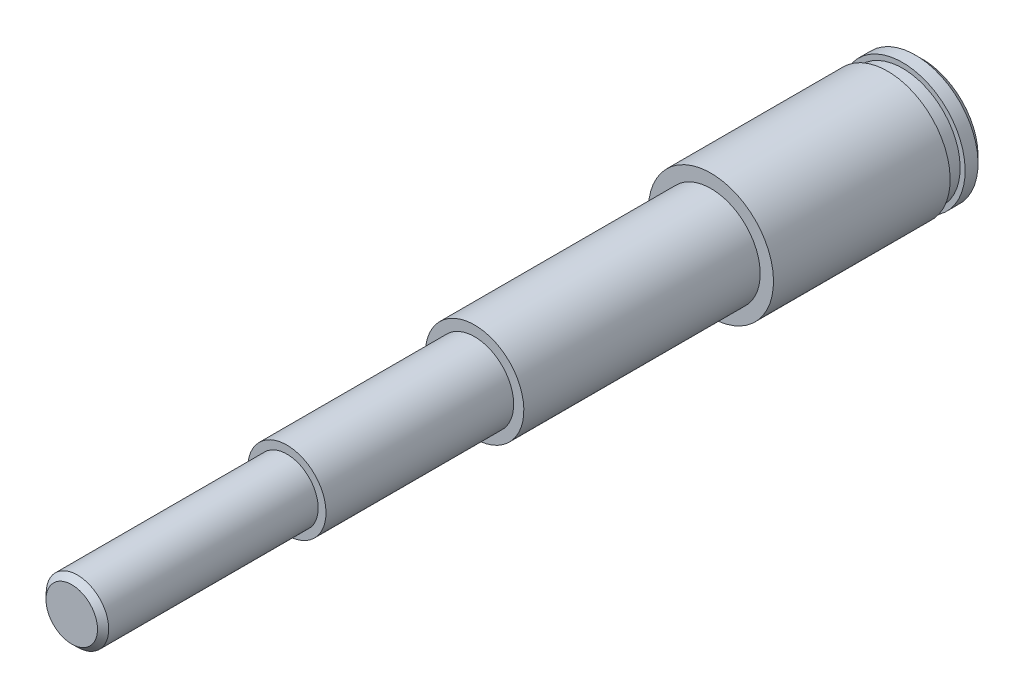
ISO-10303-21;
HEADER;
FILE_DESCRIPTION(('STEP AP214'),'2;1');
FILE_NAME('part.step','',(''),(''),'','','');
FILE_SCHEMA(('AUTOMOTIVE_DESIGN { 1 0 10303 214 1 1 1 1 }'));
ENDSEC;
DATA;
#1=APPLICATION_CONTEXT('core data for automotive mechanical design processes');
#2=APPLICATION_PROTOCOL_DEFINITION('international standard','automotive_design',2000,#1);
#3=PRODUCT_CONTEXT('',#1,'mechanical');
#4=PRODUCT('Part','Part','',(#3));
#5=PRODUCT_RELATED_PRODUCT_CATEGORY('part','',(#4));
#6=PRODUCT_DEFINITION_FORMATION('','',#4);
#7=PRODUCT_DEFINITION_CONTEXT('part definition',#1,'design');
#8=PRODUCT_DEFINITION('design','',#6,#7);
#9=PRODUCT_DEFINITION_SHAPE('','',#8);
#10=(LENGTH_UNIT() NAMED_UNIT(*) SI_UNIT(.MILLI.,.METRE.));
#11=(NAMED_UNIT(*) PLANE_ANGLE_UNIT() SI_UNIT($,.RADIAN.));
#12=(NAMED_UNIT(*) SI_UNIT($,.STERADIAN.) SOLID_ANGLE_UNIT());
#13=UNCERTAINTY_MEASURE_WITH_UNIT(LENGTH_MEASURE(1.E-05),#10,'distance_accuracy_value','');
#14=(GEOMETRIC_REPRESENTATION_CONTEXT(3) GLOBAL_UNCERTAINTY_ASSIGNED_CONTEXT((#13)) GLOBAL_UNIT_ASSIGNED_CONTEXT((#10,
#11,#12)) REPRESENTATION_CONTEXT('',''));
#15=CARTESIAN_POINT('',(0.,0.,0.));
#16=DIRECTION('',(0.,0.,1.));
#17=DIRECTION('',(1.,0.,0.));
#18=AXIS2_PLACEMENT_3D('',#15,#16,#17);
#19=CARTESIAN_POINT('',(0.,0.363804758208036,19.8067704128135));
#20=DIRECTION('',(0.,0.,-1.));
#21=DIRECTION('',(0.,1.,0.));
#22=AXIS2_PLACEMENT_3D('',#19,#20,#21);
#23=PLANE('',#22);
#24=CARTESIAN_POINT('',(0.,0.363804758208036,19.8067704128135));
#25=DIRECTION('',(0.,0.,1.));
#26=DIRECTION('',(0.,-1.,0.));
#27=AXIS2_PLACEMENT_3D('',#24,#25,#26);
#28=CIRCLE('',#27,1.30799382820672);
#29=CARTESIAN_POINT('',(0.,-0.944189069998681,19.8067704128135));
#30=VERTEX_POINT('',#29);
#31=EDGE_CURVE('E10',#30,#30,#28,.T.);
#32=ORIENTED_EDGE('',*,*,#31,.T.);
#33=EDGE_LOOP('',(#32));
#34=FACE_BOUND('',#33,.T.);
#35=ADVANCED_FACE('F31',(#34),#23,.F.);
#36=CARTESIAN_POINT('',(0.,0.363804758208036,19.5171006220107));
#37=DIRECTION('',(0.,0.,-1.));
#38=DIRECTION('',(0.,1.,0.));
#39=AXIS2_PLACEMENT_3D('',#36,#37,#38);
#40=CONICAL_SURFACE('',#39,1.5875,0.76754333533404);
#41=ORIENTED_EDGE('',*,*,#31,.F.);
#42=EDGE_LOOP('',(#41));
#43=FACE_BOUND('',#42,.T.);
#44=CARTESIAN_POINT('',(0.,0.363804758208036,19.5171006220107));
#45=DIRECTION('',(0.,0.,1.));
#46=DIRECTION('',(0.,-1.,0.));
#47=AXIS2_PLACEMENT_3D('',#44,#45,#46);
#48=CIRCLE('',#47,1.5875);
#49=CARTESIAN_POINT('',(0.,-1.22369524179197,19.5171006220107));
#50=VERTEX_POINT('',#49);
#51=EDGE_CURVE('E37',#50,#50,#48,.T.);
#52=ORIENTED_EDGE('',*,*,#51,.T.);
#53=EDGE_LOOP('',(#52));
#54=FACE_BOUND('',#53,.T.);
#55=ADVANCED_FACE('F93',(#43,#54),#40,.T.);
#56=CARTESIAN_POINT('',(0.,0.363804758208036,19.8067704128135));
#57=DIRECTION('',(0.,0.,1.));
#58=DIRECTION('',(0.,-1.,0.));
#59=AXIS2_PLACEMENT_3D('',#56,#57,#58);
#60=CYLINDRICAL_SURFACE('',#59,1.5875);
#61=ORIENTED_EDGE('',*,*,#51,.F.);
#62=EDGE_LOOP('',(#61));
#63=FACE_BOUND('',#62,.T.);
#64=CARTESIAN_POINT('',(0.,0.363804758208037,8.88332485599562));
#65=DIRECTION('',(0.,0.,1.));
#66=DIRECTION('',(0.,-1.,0.));
#67=AXIS2_PLACEMENT_3D('',#64,#65,#66);
#68=CIRCLE('',#67,1.5875);
#69=CARTESIAN_POINT('',(0.,-1.22369524179197,8.88332485599562));
#70=VERTEX_POINT('',#69);
#71=EDGE_CURVE('E41',#70,#70,#68,.T.);
#72=ORIENTED_EDGE('',*,*,#71,.T.);
#73=EDGE_LOOP('',(#72));
#74=FACE_BOUND('',#73,.T.);
#75=ADVANCED_FACE('F97',(#63,#74),#60,.T.);
#76=CARTESIAN_POINT('',(0.,1.95130475820804,8.88332485599562));
#77=DIRECTION('',(0.,0.,-1.));
#78=DIRECTION('',(0.,1.,0.));
#79=AXIS2_PLACEMENT_3D('',#76,#77,#78);
#80=PLANE('',#79);
#81=ORIENTED_EDGE('',*,*,#71,.F.);
#82=EDGE_LOOP('',(#81));
#83=FACE_BOUND('',#82,.T.);
#84=CARTESIAN_POINT('',(0.,0.363804758208037,8.88332485599562));
#85=DIRECTION('',(0.,0.,1.));
#86=DIRECTION('',(0.,-1.,0.));
#87=AXIS2_PLACEMENT_3D('',#84,#85,#86);
#88=CIRCLE('',#87,1.98437499999975);
#89=CARTESIAN_POINT('',(0.,-1.62057024179171,8.88332485599562));
#90=VERTEX_POINT('',#89);
#91=EDGE_CURVE('E45',#90,#90,#88,.T.);
#92=ORIENTED_EDGE('',*,*,#91,.T.);
#93=EDGE_LOOP('',(#92));
#94=FACE_BOUND('',#93,.T.);
#95=ADVANCED_FACE('F102',(#83,#94),#80,.F.);
#96=CARTESIAN_POINT('',(0.,0.363804758208036,19.8067704128135));
#97=DIRECTION('',(0.,0.,1.));
#98=DIRECTION('',(0.,-1.,0.));
#99=AXIS2_PLACEMENT_3D('',#96,#97,#98);
#100=CYLINDRICAL_SURFACE('',#99,1.98437499999975);
#101=ORIENTED_EDGE('',*,*,#91,.F.);
#102=EDGE_LOOP('',(#101));
#103=FACE_BOUND('',#102,.T.);
#104=CARTESIAN_POINT('',(0.,0.363804758208038,-0.645515011623191));
#105=DIRECTION('',(0.,0.,1.));
#106=DIRECTION('',(0.,-1.,0.));
#107=AXIS2_PLACEMENT_3D('',#104,#105,#106);
#108=CIRCLE('',#107,1.98437499999975);
#109=CARTESIAN_POINT('',(0.,-1.62057024179171,-0.645515011623191));
#110=VERTEX_POINT('',#109);
#111=EDGE_CURVE('E50',#110,#110,#108,.T.);
#112=ORIENTED_EDGE('',*,*,#111,.T.);
#113=EDGE_LOOP('',(#112));
#114=FACE_BOUND('',#113,.T.);
#115=ADVANCED_FACE('F108',(#103,#114),#100,.T.);
#116=CARTESIAN_POINT('',(0.,2.34817975820779,-0.645515011623193));
#117=DIRECTION('',(0.,0.,-1.));
#118=DIRECTION('',(0.,1.,0.));
#119=AXIS2_PLACEMENT_3D('',#116,#117,#118);
#120=PLANE('',#119);
#121=ORIENTED_EDGE('',*,*,#111,.F.);
#122=EDGE_LOOP('',(#121));
#123=FACE_BOUND('',#122,.T.);
#124=CARTESIAN_POINT('',(0.,0.363804758208038,-0.645515011623191));
#125=DIRECTION('',(0.,0.,1.));
#126=DIRECTION('',(0.,-1.,0.));
#127=AXIS2_PLACEMENT_3D('',#124,#125,#126);
#128=CIRCLE('',#127,2.5);
#129=CARTESIAN_POINT('',(0.,-2.13619524179196,-0.645515011623192));
#130=VERTEX_POINT('',#129);
#131=EDGE_CURVE('E53',#130,#130,#128,.T.);
#132=ORIENTED_EDGE('',*,*,#131,.T.);
#133=EDGE_LOOP('',(#132));
#134=FACE_BOUND('',#133,.T.);
#135=ADVANCED_FACE('F112',(#123,#134),#120,.F.);
#136=CARTESIAN_POINT('',(0.,0.363804758208036,19.8067704128135));
#137=DIRECTION('',(0.,0.,1.));
#138=DIRECTION('',(0.,-1.,0.));
#139=AXIS2_PLACEMENT_3D('',#136,#137,#138);
#140=CYLINDRICAL_SURFACE('',#139,2.5);
#141=ORIENTED_EDGE('',*,*,#131,.F.);
#142=EDGE_LOOP('',(#141));
#143=FACE_BOUND('',#142,.T.);
#144=CARTESIAN_POINT('',(0.,0.363804758208039,-12.6455654059886));
#145=DIRECTION('',(0.,0.,1.));
#146=DIRECTION('',(0.,-1.,0.));
#147=AXIS2_PLACEMENT_3D('',#144,#145,#146);
#148=CIRCLE('',#147,2.5);
#149=CARTESIAN_POINT('',(0.,-2.13619524179196,-12.6455654059886));
#150=VERTEX_POINT('',#149);
#151=EDGE_CURVE('E56',#150,#150,#148,.T.);
#152=ORIENTED_EDGE('',*,*,#151,.T.);
#153=EDGE_LOOP('',(#152));
#154=FACE_BOUND('',#153,.T.);
#155=ADVANCED_FACE('F116',(#143,#154),#140,.T.);
#156=CARTESIAN_POINT('',(0.,2.86380475820804,-12.6455654059886));
#157=DIRECTION('',(0.,0.,-1.));
#158=DIRECTION('',(0.,1.,0.));
#159=AXIS2_PLACEMENT_3D('',#156,#157,#158);
#160=PLANE('',#159);
#161=ORIENTED_EDGE('',*,*,#151,.F.);
#162=EDGE_LOOP('',(#161));
#163=FACE_BOUND('',#162,.T.);
#164=CARTESIAN_POINT('',(0.,0.363804758208039,-12.6455654059886));
#165=DIRECTION('',(0.,0.,1.));
#166=DIRECTION('',(0.,-1.,0.));
#167=AXIS2_PLACEMENT_3D('',#164,#165,#166);
#168=CIRCLE('',#167,3.175);
#169=CARTESIAN_POINT('',(0.,-2.81119524179196,-12.6455654059886));
#170=VERTEX_POINT('',#169);
#171=EDGE_CURVE('E59',#170,#170,#168,.T.);
#172=ORIENTED_EDGE('',*,*,#171,.T.);
#173=EDGE_LOOP('',(#172));
#174=FACE_BOUND('',#173,.T.);
#175=ADVANCED_FACE('F120',(#163,#174),#160,.F.);
#176=CARTESIAN_POINT('',(0.,0.363804758208036,19.8067704128135));
#177=DIRECTION('',(0.,0.,1.));
#178=DIRECTION('',(0.,-1.,0.));
#179=AXIS2_PLACEMENT_3D('',#176,#177,#178);
#180=CYLINDRICAL_SURFACE('',#179,3.175);
#181=ORIENTED_EDGE('',*,*,#171,.F.);
#182=EDGE_LOOP('',(#181));
#183=FACE_BOUND('',#182,.T.);
#184=CARTESIAN_POINT('',(0.,0.363804758208041,-21.6149999162531));
#185=DIRECTION('',(0.,0.,1.));
#186=DIRECTION('',(0.,-1.,0.));
#187=AXIS2_PLACEMENT_3D('',#184,#185,#186);
#188=CIRCLE('',#187,3.175);
#189=CARTESIAN_POINT('',(0.,-2.81119524179196,-21.6149999162531));
#190=VERTEX_POINT('',#189);
#191=EDGE_CURVE('E62',#190,#190,#188,.T.);
#192=ORIENTED_EDGE('',*,*,#191,.T.);
#193=EDGE_LOOP('',(#192));
#194=FACE_BOUND('',#193,.T.);
#195=ADVANCED_FACE('F124',(#183,#194),#180,.T.);
#196=CARTESIAN_POINT('',(0.,3.53880475820804,-21.6149999162531));
#197=DIRECTION('',(0.,0.,1.));
#198=DIRECTION('',(0.,-1.,0.));
#199=AXIS2_PLACEMENT_3D('',#196,#197,#198);
#200=PLANE('',#199);
#201=ORIENTED_EDGE('',*,*,#191,.F.);
#202=EDGE_LOOP('',(#201));
#203=FACE_BOUND('',#202,.T.);
#204=CARTESIAN_POINT('',(0.,0.363804758208041,-21.6149999162531));
#205=DIRECTION('',(0.,0.,1.));
#206=DIRECTION('',(0.,-1.,0.));
#207=AXIS2_PLACEMENT_3D('',#204,#205,#206);
#208=CIRCLE('',#207,2.921);
#209=CARTESIAN_POINT('',(0.,-2.55719524179196,-21.6149999162531));
#210=VERTEX_POINT('',#209);
#211=EDGE_CURVE('E65',#210,#210,#208,.T.);
#212=ORIENTED_EDGE('',*,*,#211,.T.);
#213=EDGE_LOOP('',(#212));
#214=FACE_BOUND('',#213,.T.);
#215=ADVANCED_FACE('F128',(#203,#214),#200,.F.);
#216=CARTESIAN_POINT('',(0.,0.363804758208036,19.8067704128135));
#217=DIRECTION('',(0.,0.,1.));
#218=DIRECTION('',(0.,-1.,0.));
#219=AXIS2_PLACEMENT_3D('',#216,#217,#218);
#220=CYLINDRICAL_SURFACE('',#219,2.921);
#221=ORIENTED_EDGE('',*,*,#211,.F.);
#222=EDGE_LOOP('',(#221));
#223=FACE_BOUND('',#222,.T.);
#224=CARTESIAN_POINT('',(0.,0.363804758208041,-22.3769999162531));
#225=DIRECTION('',(0.,0.,1.));
#226=DIRECTION('',(0.,-1.,0.));
#227=AXIS2_PLACEMENT_3D('',#224,#225,#226);
#228=CIRCLE('',#227,2.921);
#229=CARTESIAN_POINT('',(0.,-2.55719524179196,-22.3769999162531));
#230=VERTEX_POINT('',#229);
#231=EDGE_CURVE('E68',#230,#230,#228,.T.);
#232=ORIENTED_EDGE('',*,*,#231,.T.);
#233=EDGE_LOOP('',(#232));
#234=FACE_BOUND('',#233,.T.);
#235=ADVANCED_FACE('F132',(#223,#234),#220,.T.);
#236=CARTESIAN_POINT('',(0.,3.53880475820804,-22.3769999162531));
#237=DIRECTION('',(0.,0.,-1.));
#238=DIRECTION('',(0.,1.,0.));
#239=AXIS2_PLACEMENT_3D('',#236,#237,#238);
#240=PLANE('',#239);
#241=ORIENTED_EDGE('',*,*,#231,.F.);
#242=EDGE_LOOP('',(#241));
#243=FACE_BOUND('',#242,.T.);
#244=CARTESIAN_POINT('',(0.,0.363804758208041,-22.3769999162531));
#245=DIRECTION('',(0.,0.,1.));
#246=DIRECTION('',(0.,-1.,0.));
#247=AXIS2_PLACEMENT_3D('',#244,#245,#246);
#248=CIRCLE('',#247,3.175);
#249=CARTESIAN_POINT('',(0.,-2.81119524179196,-22.3769999162531));
#250=VERTEX_POINT('',#249);
#251=EDGE_CURVE('E71',#250,#250,#248,.T.);
#252=ORIENTED_EDGE('',*,*,#251,.T.);
#253=EDGE_LOOP('',(#252));
#254=FACE_BOUND('',#253,.T.);
#255=ADVANCED_FACE('F136',(#243,#254),#240,.F.);
#256=CARTESIAN_POINT('',(0.,0.363804758208036,19.8067704128135));
#257=DIRECTION('',(0.,0.,1.));
#258=DIRECTION('',(0.,-1.,0.));
#259=AXIS2_PLACEMENT_3D('',#256,#257,#258);
#260=CYLINDRICAL_SURFACE('',#259,3.175);
#261=ORIENTED_EDGE('',*,*,#251,.F.);
#262=EDGE_LOOP('',(#261));
#263=FACE_BOUND('',#262,.T.);
#264=CARTESIAN_POINT('',(0.,0.363804758208041,-23.0302830595851));
#265=DIRECTION('',(0.,0.,1.));
#266=DIRECTION('',(0.,-1.,0.));
#267=AXIS2_PLACEMENT_3D('',#264,#265,#266);
#268=CIRCLE('',#267,3.175);
#269=CARTESIAN_POINT('',(0.,-2.81119524179196,-23.0302830595851));
#270=VERTEX_POINT('',#269);
#271=EDGE_CURVE('E74',#270,#270,#268,.T.);
#272=ORIENTED_EDGE('',*,*,#271,.T.);
#273=EDGE_LOOP('',(#272));
#274=FACE_BOUND('',#273,.T.);
#275=ADVANCED_FACE('F89',(#263,#274),#260,.T.);
#276=CARTESIAN_POINT('',(0.,0.363804758208041,-23.3793314040557));
#277=DIRECTION('',(0.,0.,1.));
#278=DIRECTION('',(0.,-1.,0.));
#279=AXIS2_PLACEMENT_3D('',#276,#277,#278);
#280=CONICAL_SURFACE('',#279,2.82595165552937,0.785398163397446);
#281=ORIENTED_EDGE('',*,*,#271,.F.);
#282=EDGE_LOOP('',(#281));
#283=FACE_BOUND('',#282,.T.);
#284=CARTESIAN_POINT('',(0.,0.363804758208041,-23.3793314040557));
#285=DIRECTION('',(0.,0.,1.));
#286=DIRECTION('',(0.,-1.,0.));
#287=AXIS2_PLACEMENT_3D('',#284,#285,#286);
#288=CIRCLE('',#287,2.82595165552937);
#289=CARTESIAN_POINT('',(0.,-2.46214689732133,-23.3793314040557));
#290=VERTEX_POINT('',#289);
#291=EDGE_CURVE('E77',#290,#290,#288,.T.);
#292=ORIENTED_EDGE('',*,*,#291,.T.);
#293=EDGE_LOOP('',(#292));
#294=FACE_BOUND('',#293,.T.);
#295=ADVANCED_FACE('F81',(#283,#294),#280,.T.);
#296=CARTESIAN_POINT('',(0.,3.18975641373741,-23.3793314040557));
#297=DIRECTION('',(0.,0.,1.));
#298=DIRECTION('',(0.,-1.,0.));
#299=AXIS2_PLACEMENT_3D('',#296,#297,#298);
#300=PLANE('',#299);
#301=ORIENTED_EDGE('',*,*,#291,.F.);
#302=EDGE_LOOP('',(#301));
#303=FACE_BOUND('',#302,.T.);
#304=ADVANCED_FACE('F83',(#303),#300,.F.);
#305=CLOSED_SHELL('',(#35,#55,#75,#95,#115,#135,#155,#175,#195,#215,#235,#255,#275,#295,#304));
#306=MANIFOLD_SOLID_BREP('B2',#305);
#307=ADVANCED_BREP_SHAPE_REPRESENTATION('',(#18,#306),#14);
#308=SHAPE_DEFINITION_REPRESENTATION(#9,#307);
ENDSEC;
END-ISO-10303-21;
